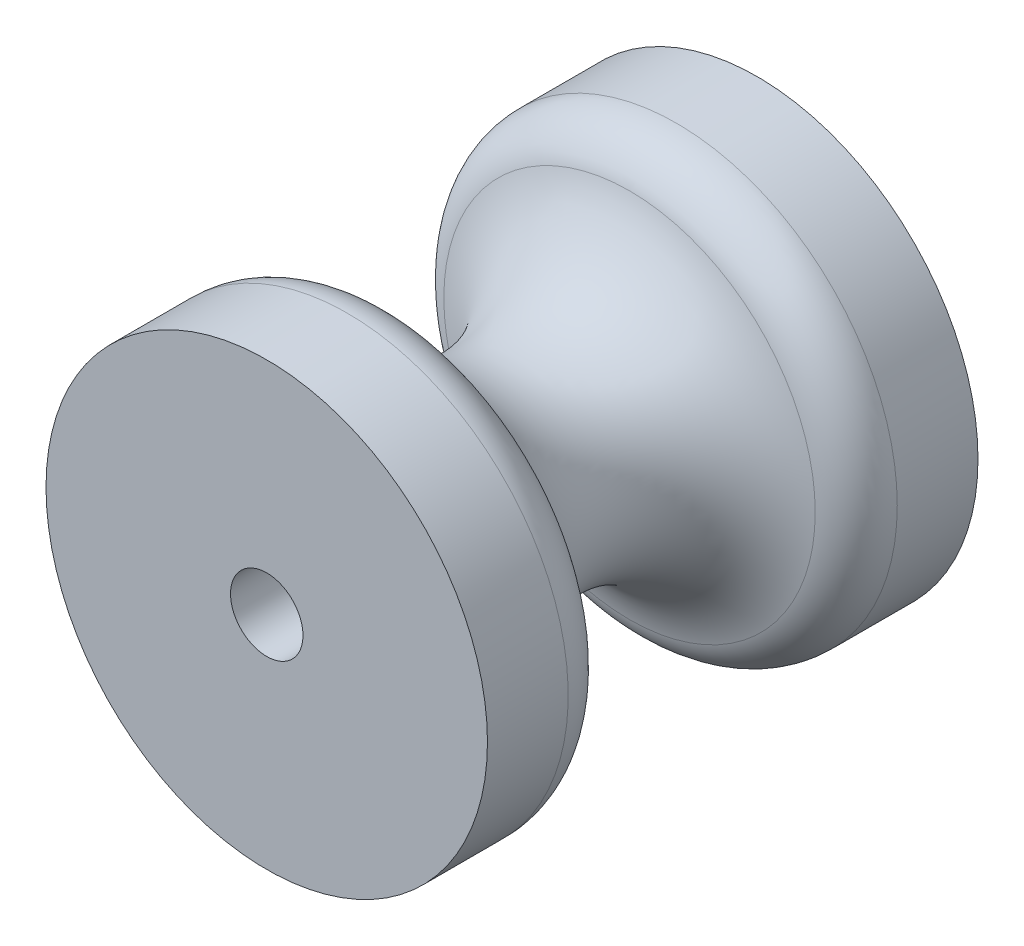
ISO-10303-21;
HEADER;
FILE_DESCRIPTION(('STEP AP214'),'2;1');
FILE_NAME('part.step','',(''),(''),'','','');
FILE_SCHEMA(('AUTOMOTIVE_DESIGN { 1 0 10303 214 1 1 1 1 }'));
ENDSEC;
DATA;
#1=APPLICATION_CONTEXT('core data for automotive mechanical design processes');
#2=APPLICATION_PROTOCOL_DEFINITION('international standard','automotive_design',2000,#1);
#3=PRODUCT_CONTEXT('',#1,'mechanical');
#4=PRODUCT('Part','Part','',(#3));
#5=PRODUCT_RELATED_PRODUCT_CATEGORY('part','',(#4));
#6=PRODUCT_DEFINITION_FORMATION('','',#4);
#7=PRODUCT_DEFINITION_CONTEXT('part definition',#1,'design');
#8=PRODUCT_DEFINITION('design','',#6,#7);
#9=PRODUCT_DEFINITION_SHAPE('','',#8);
#10=(LENGTH_UNIT() NAMED_UNIT(*) SI_UNIT(.MILLI.,.METRE.));
#11=(NAMED_UNIT(*) PLANE_ANGLE_UNIT() SI_UNIT($,.RADIAN.));
#12=(NAMED_UNIT(*) SI_UNIT($,.STERADIAN.) SOLID_ANGLE_UNIT());
#13=UNCERTAINTY_MEASURE_WITH_UNIT(LENGTH_MEASURE(1.E-05),#10,'distance_accuracy_value','');
#14=(GEOMETRIC_REPRESENTATION_CONTEXT(3) GLOBAL_UNCERTAINTY_ASSIGNED_CONTEXT((#13)) GLOBAL_UNIT_ASSIGNED_CONTEXT((#10,
#11,#12)) REPRESENTATION_CONTEXT('',''));
#15=CARTESIAN_POINT('',(0.,0.,0.));
#16=DIRECTION('',(0.,0.,1.));
#17=DIRECTION('',(1.,0.,0.));
#18=AXIS2_PLACEMENT_3D('',#15,#16,#17);
#19=CARTESIAN_POINT('',(0.,0.,200.));
#20=DIRECTION('',(0.,0.,-1.));
#21=DIRECTION('',(-1.,0.,0.));
#22=AXIS2_PLACEMENT_3D('',#19,#20,#21);
#23=CYLINDRICAL_SURFACE('',#22,90.);
#24=CARTESIAN_POINT('',(0.,0.,32.9179606750063));
#25=DIRECTION('',(0.,0.,1.));
#26=DIRECTION('',(1.,0.,0.));
#27=AXIS2_PLACEMENT_3D('',#24,#25,#26);
#28=CIRCLE('',#27,90.);
#29=CARTESIAN_POINT('',(90.,0.,32.9179606750063));
#30=VERTEX_POINT('',#29);
#31=EDGE_CURVE('E55',#30,#30,#28,.F.);
#32=ORIENTED_EDGE('',*,*,#31,.T.);
#33=EDGE_LOOP('',(#32));
#34=FACE_BOUND('',#33,.T.);
#35=CARTESIAN_POINT('',(0.,0.,0.));
#36=DIRECTION('',(0.,0.,1.));
#37=DIRECTION('',(1.,0.,0.));
#38=AXIS2_PLACEMENT_3D('',#35,#36,#37);
#39=CIRCLE('',#38,90.);
#40=CARTESIAN_POINT('',(90.,0.,0.));
#41=VERTEX_POINT('',#40);
#42=EDGE_CURVE('E62',#41,#41,#39,.T.);
#43=ORIENTED_EDGE('',*,*,#42,.T.);
#44=EDGE_LOOP('',(#43));
#45=FACE_BOUND('',#44,.T.);
#46=ADVANCED_FACE('F37',(#34,#45),#23,.T.);
#47=CARTESIAN_POINT('',(0.,0.,0.));
#48=DIRECTION('',(0.,0.,1.));
#49=DIRECTION('',(1.,0.,0.));
#50=AXIS2_PLACEMENT_3D('',#47,#48,#49);
#51=PLANE('',#50);
#52=CARTESIAN_POINT('',(0.,0.,0.));
#53=DIRECTION('',(0.,0.,1.));
#54=DIRECTION('',(1.,0.,0.));
#55=AXIS2_PLACEMENT_3D('',#52,#53,#54);
#56=CIRCLE('',#55,14.7760341333804);
#57=CARTESIAN_POINT('',(14.7760341333804,0.,0.));
#58=VERTEX_POINT('',#57);
#59=EDGE_CURVE('E66',#58,#58,#56,.T.);
#60=ORIENTED_EDGE('',*,*,#59,.T.);
#61=EDGE_LOOP('',(#60));
#62=FACE_BOUND('',#61,.T.);
#63=ORIENTED_EDGE('',*,*,#42,.F.);
#64=EDGE_LOOP('',(#63));
#65=FACE_BOUND('',#64,.T.);
#66=ADVANCED_FACE('F98',(#62,#65),#51,.F.);
#67=CARTESIAN_POINT('',(0.,0.,100.));
#68=DIRECTION('',(0.,0.,-1.));
#69=DIRECTION('',(-1.,0.,0.));
#70=AXIS2_PLACEMENT_3D('',#67,#68,#69);
#71=TOROIDAL_SURFACE('',#70,90.,50.);
#72=CARTESIAN_POINT('',(0.,0.,52.0842576250044));
#73=DIRECTION('',(0.,0.,1.));
#74=DIRECTION('',(1.,0.,0.));
#75=AXIS2_PLACEMENT_3D('',#72,#73,#74);
#76=CIRCLE('',#75,75.7142857142857);
#77=CARTESIAN_POINT('',(75.7142857142857,0.,52.0842576250044));
#78=VERTEX_POINT('',#77);
#79=EDGE_CURVE('E45',#78,#78,#76,.T.);
#80=ORIENTED_EDGE('',*,*,#79,.T.);
#81=EDGE_LOOP('',(#80));
#82=FACE_BOUND('',#81,.T.);
#83=CARTESIAN_POINT('',(0.,0.,147.915742374996));
#84=DIRECTION('',(0.,0.,-1.));
#85=DIRECTION('',(-1.,0.,0.));
#86=AXIS2_PLACEMENT_3D('',#83,#84,#85);
#87=CIRCLE('',#86,75.7142857142857);
#88=CARTESIAN_POINT('',(-75.7142857142857,0.,147.915742374996));
#89=VERTEX_POINT('',#88);
#90=EDGE_CURVE('E50',#89,#89,#87,.T.);
#91=ORIENTED_EDGE('',*,*,#90,.T.);
#92=EDGE_LOOP('',(#91));
#93=FACE_BOUND('',#92,.T.);
#94=ADVANCED_FACE('F85',(#82,#93),#71,.F.);
#95=CARTESIAN_POINT('',(0.,0.,200.));
#96=DIRECTION('',(0.,0.,1.));
#97=DIRECTION('',(1.,0.,0.));
#98=AXIS2_PLACEMENT_3D('',#95,#96,#97);
#99=PLANE('',#98);
#100=CARTESIAN_POINT('',(0.,0.,200.));
#101=DIRECTION('',(0.,0.,1.));
#102=DIRECTION('',(1.,0.,0.));
#103=AXIS2_PLACEMENT_3D('',#100,#101,#102);
#104=CIRCLE('',#103,14.7760341333804);
#105=CARTESIAN_POINT('',(14.7760341333804,0.,200.));
#106=VERTEX_POINT('',#105);
#107=EDGE_CURVE('E73',#106,#106,#104,.T.);
#108=ORIENTED_EDGE('',*,*,#107,.F.);
#109=EDGE_LOOP('',(#108));
#110=FACE_BOUND('',#109,.T.);
#111=CARTESIAN_POINT('',(0.,0.,200.));
#112=DIRECTION('',(0.,0.,1.));
#113=DIRECTION('',(1.,0.,0.));
#114=AXIS2_PLACEMENT_3D('',#111,#112,#113);
#115=CIRCLE('',#114,90.);
#116=CARTESIAN_POINT('',(90.,0.,200.));
#117=VERTEX_POINT('',#116);
#118=EDGE_CURVE('E61',#117,#117,#115,.T.);
#119=ORIENTED_EDGE('',*,*,#118,.T.);
#120=EDGE_LOOP('',(#119));
#121=FACE_BOUND('',#120,.T.);
#122=ADVANCED_FACE('F81',(#110,#121),#99,.T.);
#123=CARTESIAN_POINT('',(0.,0.,167.082039324994));
#124=DIRECTION('',(0.,0.,-1.));
#125=DIRECTION('',(-1.,0.,0.));
#126=AXIS2_PLACEMENT_3D('',#123,#124,#125);
#127=CIRCLE('',#126,90.);
#128=CARTESIAN_POINT('',(-90.,0.,167.082039324994));
#129=VERTEX_POINT('',#128);
#130=EDGE_CURVE('E10',#129,#129,#127,.F.);
#131=ORIENTED_EDGE('',*,*,#130,.T.);
#132=EDGE_LOOP('',(#131));
#133=FACE_BOUND('',#132,.T.);
#134=ORIENTED_EDGE('',*,*,#118,.F.);
#135=EDGE_LOOP('',(#134));
#136=FACE_BOUND('',#135,.T.);
#137=ADVANCED_FACE('F84',(#133,#136),#23,.T.);
#138=CARTESIAN_POINT('',(0.,0.,32.9179606750063));
#139=DIRECTION('',(0.,0.,1.));
#140=DIRECTION('',(1.,0.,0.));
#141=AXIS2_PLACEMENT_3D('',#138,#139,#140);
#142=TOROIDAL_SURFACE('',#141,70.,20.);
#143=ORIENTED_EDGE('',*,*,#79,.F.);
#144=EDGE_LOOP('',(#143));
#145=FACE_BOUND('',#144,.T.);
#146=ORIENTED_EDGE('',*,*,#31,.F.);
#147=EDGE_LOOP('',(#146));
#148=FACE_BOUND('',#147,.T.);
#149=ADVANCED_FACE('F90',(#145,#148),#142,.T.);
#150=CARTESIAN_POINT('',(0.,0.,167.082039324994));
#151=DIRECTION('',(0.,0.,-1.));
#152=DIRECTION('',(-1.,0.,0.));
#153=AXIS2_PLACEMENT_3D('',#150,#151,#152);
#154=TOROIDAL_SURFACE('',#153,70.,20.);
#155=ORIENTED_EDGE('',*,*,#90,.F.);
#156=EDGE_LOOP('',(#155));
#157=FACE_BOUND('',#156,.T.);
#158=ORIENTED_EDGE('',*,*,#130,.F.);
#159=EDGE_LOOP('',(#158));
#160=FACE_BOUND('',#159,.T.);
#161=ADVANCED_FACE('F39',(#157,#160),#154,.T.);
#162=CARTESIAN_POINT('',(0.,0.,-300.));
#163=DIRECTION('',(0.,0.,1.));
#164=DIRECTION('',(1.,0.,0.));
#165=AXIS2_PLACEMENT_3D('',#162,#163,#164);
#166=CYLINDRICAL_SURFACE('',#165,14.7760341333804);
#167=ORIENTED_EDGE('',*,*,#107,.T.);
#168=EDGE_LOOP('',(#167));
#169=FACE_BOUND('',#168,.T.);
#170=ORIENTED_EDGE('',*,*,#59,.F.);
#171=EDGE_LOOP('',(#170));
#172=FACE_BOUND('',#171,.T.);
#173=ADVANCED_FACE('F78',(#169,#172),#166,.F.);
#174=CLOSED_SHELL('',(#46,#66,#94,#122,#137,#149,#161,#173));
#175=MANIFOLD_SOLID_BREP('B2',#174);
#176=ADVANCED_BREP_SHAPE_REPRESENTATION('',(#18,#175),#14);
#177=SHAPE_DEFINITION_REPRESENTATION(#9,#176);
ENDSEC;
END-ISO-10303-21;
